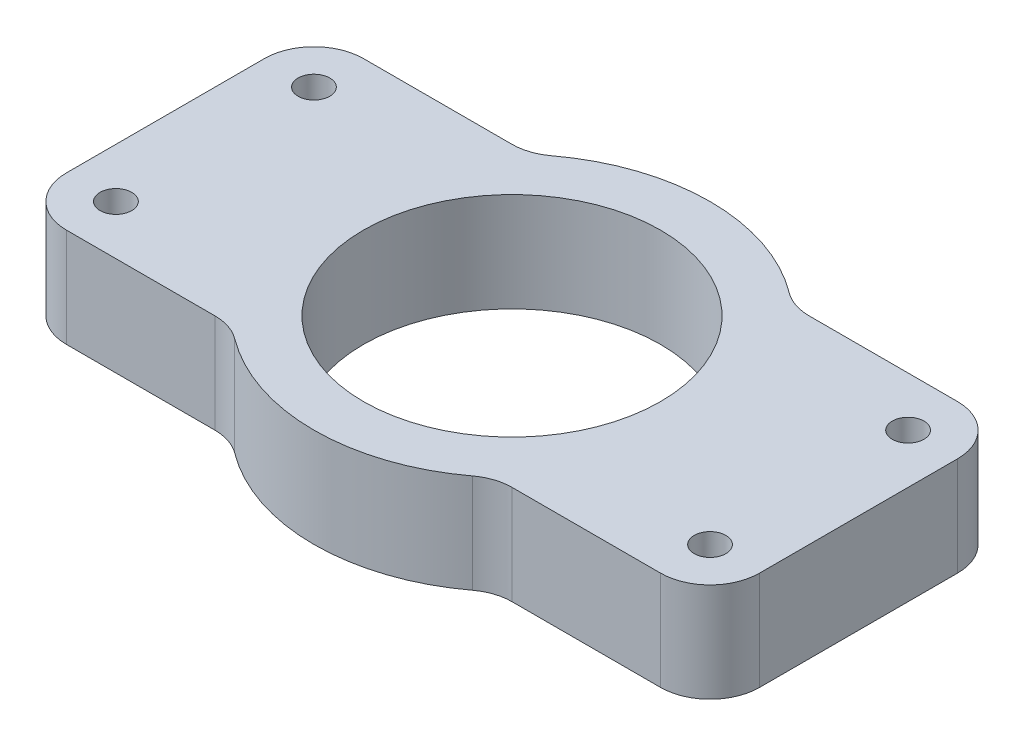
ISO-10303-21;
HEADER;
FILE_DESCRIPTION(('STEP AP214'),'2;1');
FILE_NAME('part.step','',(''),(''),'','','');
FILE_SCHEMA(('AUTOMOTIVE_DESIGN { 1 0 10303 214 1 1 1 1 }'));
ENDSEC;
DATA;
#1=APPLICATION_CONTEXT('core data for automotive mechanical design processes');
#2=APPLICATION_PROTOCOL_DEFINITION('international standard','automotive_design',2000,#1);
#3=PRODUCT_CONTEXT('',#1,'mechanical');
#4=PRODUCT('Part','Part','',(#3));
#5=PRODUCT_RELATED_PRODUCT_CATEGORY('part','',(#4));
#6=PRODUCT_DEFINITION_FORMATION('','',#4);
#7=PRODUCT_DEFINITION_CONTEXT('part definition',#1,'design');
#8=PRODUCT_DEFINITION('design','',#6,#7);
#9=PRODUCT_DEFINITION_SHAPE('','',#8);
#10=(LENGTH_UNIT() NAMED_UNIT(*) SI_UNIT(.MILLI.,.METRE.));
#11=(NAMED_UNIT(*) PLANE_ANGLE_UNIT() SI_UNIT($,.RADIAN.));
#12=(NAMED_UNIT(*) SI_UNIT($,.STERADIAN.) SOLID_ANGLE_UNIT());
#13=UNCERTAINTY_MEASURE_WITH_UNIT(LENGTH_MEASURE(1.E-05),#10,'distance_accuracy_value','');
#14=(GEOMETRIC_REPRESENTATION_CONTEXT(3) GLOBAL_UNCERTAINTY_ASSIGNED_CONTEXT((#13)) GLOBAL_UNIT_ASSIGNED_CONTEXT((#10,
#11,#12)) REPRESENTATION_CONTEXT('',''));
#15=CARTESIAN_POINT('',(0.,0.,0.));
#16=DIRECTION('',(0.,0.,1.));
#17=DIRECTION('',(1.,0.,0.));
#18=AXIS2_PLACEMENT_3D('',#15,#16,#17);
#19=CARTESIAN_POINT('',(-35.,10.,-15.));
#20=DIRECTION('',(0.,0.,1.));
#21=DIRECTION('',(1.,0.,0.));
#22=AXIS2_PLACEMENT_3D('',#19,#20,#21);
#23=PLANE('',#22);
#24=DIRECTION('',(-1.,0.,0.));
#25=VECTOR('',#24,1.);
#26=CARTESIAN_POINT('',(-35.,10.,-15.));
#27=LINE('',#26,#25);
#28=CARTESIAN_POINT('',(-15.,10.,-15.));
#29=VERTEX_POINT('',#28);
#30=CARTESIAN_POINT('',(-30.,10.,-15.));
#31=VERTEX_POINT('',#30);
#32=EDGE_CURVE('E197',#29,#31,#27,.T.);
#33=ORIENTED_EDGE('',*,*,#32,.F.);
#34=DIRECTION('',(0.,1.,0.));
#35=VECTOR('',#34,1.);
#36=CARTESIAN_POINT('',(-15.,0.,-15.));
#37=LINE('',#36,#35);
#38=CARTESIAN_POINT('',(-15.,0.,-15.));
#39=VERTEX_POINT('',#38);
#40=EDGE_CURVE('E221',#29,#39,#37,.F.);
#41=ORIENTED_EDGE('',*,*,#40,.T.);
#42=DIRECTION('',(-1.,0.,0.));
#43=VECTOR('',#42,1.);
#44=CARTESIAN_POINT('',(-35.,0.,-15.));
#45=LINE('',#44,#43);
#46=CARTESIAN_POINT('',(-30.,0.,-15.));
#47=VERTEX_POINT('',#46);
#48=EDGE_CURVE('E209',#39,#47,#45,.T.);
#49=ORIENTED_EDGE('',*,*,#48,.T.);
#50=DIRECTION('',(0.,-1.,0.));
#51=VECTOR('',#50,1.);
#52=CARTESIAN_POINT('',(-30.,10.,-15.));
#53=LINE('',#52,#51);
#54=EDGE_CURVE('E219',#47,#31,#53,.F.);
#55=ORIENTED_EDGE('',*,*,#54,.T.);
#56=EDGE_LOOP('',(#33,#41,#49,#55));
#57=FACE_BOUND('',#56,.T.);
#58=ADVANCED_FACE('F43',(#57),#23,.F.);
#59=CARTESIAN_POINT('',(30.,0.,-15.));
#60=VERTEX_POINT('',#59);
#61=CARTESIAN_POINT('',(15.,0.,-15.));
#62=VERTEX_POINT('',#61);
#63=EDGE_CURVE('E210',#60,#62,#45,.T.);
#64=ORIENTED_EDGE('',*,*,#63,.T.);
#65=DIRECTION('',(0.,1.,0.));
#66=VECTOR('',#65,1.);
#67=CARTESIAN_POINT('',(15.,10.,-15.));
#68=LINE('',#67,#66);
#69=CARTESIAN_POINT('',(15.,10.,-15.));
#70=VERTEX_POINT('',#69);
#71=EDGE_CURVE('E162',#62,#70,#68,.T.);
#72=ORIENTED_EDGE('',*,*,#71,.T.);
#73=CARTESIAN_POINT('',(30.,10.,-15.));
#74=VERTEX_POINT('',#73);
#75=EDGE_CURVE('E199',#74,#70,#27,.T.);
#76=ORIENTED_EDGE('',*,*,#75,.F.);
#77=DIRECTION('',(0.,-1.,0.));
#78=VECTOR('',#77,1.);
#79=CARTESIAN_POINT('',(30.,10.,-15.));
#80=LINE('',#79,#78);
#81=EDGE_CURVE('E223',#74,#60,#80,.T.);
#82=ORIENTED_EDGE('',*,*,#81,.T.);
#83=EDGE_LOOP('',(#64,#72,#76,#82));
#84=FACE_BOUND('',#83,.T.);
#85=ADVANCED_FACE('F311',(#84),#23,.F.);
#86=CARTESIAN_POINT('',(-35.,10.,15.));
#87=DIRECTION('',(0.,0.,-1.));
#88=DIRECTION('',(-1.,0.,0.));
#89=AXIS2_PLACEMENT_3D('',#86,#87,#88);
#90=PLANE('',#89);
#91=DIRECTION('',(1.,0.,0.));
#92=VECTOR('',#91,1.);
#93=CARTESIAN_POINT('',(-35.,10.,15.));
#94=LINE('',#93,#92);
#95=CARTESIAN_POINT('',(15.,10.,15.));
#96=VERTEX_POINT('',#95);
#97=CARTESIAN_POINT('',(30.,10.,15.));
#98=VERTEX_POINT('',#97);
#99=EDGE_CURVE('E205',#96,#98,#94,.T.);
#100=ORIENTED_EDGE('',*,*,#99,.F.);
#101=DIRECTION('',(0.,1.,0.));
#102=VECTOR('',#101,1.);
#103=CARTESIAN_POINT('',(15.,0.,15.));
#104=LINE('',#103,#102);
#105=CARTESIAN_POINT('',(15.,0.,15.));
#106=VERTEX_POINT('',#105);
#107=EDGE_CURVE('E260',#96,#106,#104,.F.);
#108=ORIENTED_EDGE('',*,*,#107,.T.);
#109=DIRECTION('',(1.,0.,0.));
#110=VECTOR('',#109,1.);
#111=CARTESIAN_POINT('',(-35.,0.,15.));
#112=LINE('',#111,#110);
#113=CARTESIAN_POINT('',(30.,0.,15.));
#114=VERTEX_POINT('',#113);
#115=EDGE_CURVE('E215',#106,#114,#112,.T.);
#116=ORIENTED_EDGE('',*,*,#115,.T.);
#117=DIRECTION('',(0.,-1.,0.));
#118=VECTOR('',#117,1.);
#119=CARTESIAN_POINT('',(30.,10.,15.));
#120=LINE('',#119,#118);
#121=EDGE_CURVE('E258',#114,#98,#120,.F.);
#122=ORIENTED_EDGE('',*,*,#121,.T.);
#123=EDGE_LOOP('',(#100,#108,#116,#122));
#124=FACE_BOUND('',#123,.T.);
#125=ADVANCED_FACE('F297',(#124),#90,.F.);
#126=CARTESIAN_POINT('',(-30.,10.,15.));
#127=VERTEX_POINT('',#126);
#128=CARTESIAN_POINT('',(-15.,10.,15.));
#129=VERTEX_POINT('',#128);
#130=EDGE_CURVE('E180',#127,#129,#94,.T.);
#131=ORIENTED_EDGE('',*,*,#130,.F.);
#132=DIRECTION('',(0.,-1.,0.));
#133=VECTOR('',#132,1.);
#134=CARTESIAN_POINT('',(-30.,10.,15.));
#135=LINE('',#134,#133);
#136=CARTESIAN_POINT('',(-30.,0.,15.));
#137=VERTEX_POINT('',#136);
#138=EDGE_CURVE('E249',#127,#137,#135,.T.);
#139=ORIENTED_EDGE('',*,*,#138,.T.);
#140=CARTESIAN_POINT('',(-15.,0.,15.));
#141=VERTEX_POINT('',#140);
#142=EDGE_CURVE('E198',#137,#141,#112,.T.);
#143=ORIENTED_EDGE('',*,*,#142,.T.);
#144=DIRECTION('',(0.,1.,0.));
#145=VECTOR('',#144,1.);
#146=CARTESIAN_POINT('',(-15.,10.,15.));
#147=LINE('',#146,#145);
#148=EDGE_CURVE('E247',#141,#129,#147,.T.);
#149=ORIENTED_EDGE('',*,*,#148,.T.);
#150=EDGE_LOOP('',(#131,#139,#143,#149));
#151=FACE_BOUND('',#150,.T.);
#152=ADVANCED_FACE('F280',(#151),#90,.F.);
#153=CARTESIAN_POINT('',(35.,10.,15.));
#154=DIRECTION('',(-1.,0.,0.));
#155=DIRECTION('',(0.,0.,1.));
#156=AXIS2_PLACEMENT_3D('',#153,#154,#155);
#157=PLANE('',#156);
#158=DIRECTION('',(0.,0.,-1.));
#159=VECTOR('',#158,1.);
#160=CARTESIAN_POINT('',(35.,0.,15.));
#161=LINE('',#160,#159);
#162=CARTESIAN_POINT('',(35.,0.,10.));
#163=VERTEX_POINT('',#162);
#164=CARTESIAN_POINT('',(35.,0.,-10.));
#165=VERTEX_POINT('',#164);
#166=EDGE_CURVE('E207',#163,#165,#161,.T.);
#167=ORIENTED_EDGE('',*,*,#166,.T.);
#168=DIRECTION('',(0.,-1.,0.));
#169=VECTOR('',#168,1.);
#170=CARTESIAN_POINT('',(35.,10.,-10.));
#171=LINE('',#170,#169);
#172=CARTESIAN_POINT('',(35.,10.,-10.));
#173=VERTEX_POINT('',#172);
#174=EDGE_CURVE('E58',#165,#173,#171,.F.);
#175=ORIENTED_EDGE('',*,*,#174,.T.);
#176=DIRECTION('',(0.,0.,-1.));
#177=VECTOR('',#176,1.);
#178=CARTESIAN_POINT('',(35.,10.,15.));
#179=LINE('',#178,#177);
#180=CARTESIAN_POINT('',(35.,10.,10.));
#181=VERTEX_POINT('',#180);
#182=EDGE_CURVE('E195',#181,#173,#179,.T.);
#183=ORIENTED_EDGE('',*,*,#182,.F.);
#184=DIRECTION('',(0.,-1.,0.));
#185=VECTOR('',#184,1.);
#186=CARTESIAN_POINT('',(35.,10.,10.));
#187=LINE('',#186,#185);
#188=EDGE_CURVE('E262',#181,#163,#187,.T.);
#189=ORIENTED_EDGE('',*,*,#188,.T.);
#190=EDGE_LOOP('',(#167,#175,#183,#189));
#191=FACE_BOUND('',#190,.T.);
#192=ADVANCED_FACE('F304',(#191),#157,.F.);
#193=CARTESIAN_POINT('',(-35.,10.,15.));
#194=DIRECTION('',(1.,0.,0.));
#195=DIRECTION('',(0.,0.,-1.));
#196=AXIS2_PLACEMENT_3D('',#193,#194,#195);
#197=PLANE('',#196);
#198=DIRECTION('',(0.,0.,1.));
#199=VECTOR('',#198,1.);
#200=CARTESIAN_POINT('',(-35.,10.,15.));
#201=LINE('',#200,#199);
#202=CARTESIAN_POINT('',(-35.,10.,-10.));
#203=VERTEX_POINT('',#202);
#204=CARTESIAN_POINT('',(-35.,10.,10.));
#205=VERTEX_POINT('',#204);
#206=EDGE_CURVE('E202',#203,#205,#201,.T.);
#207=ORIENTED_EDGE('',*,*,#206,.F.);
#208=DIRECTION('',(0.,-1.,0.));
#209=VECTOR('',#208,1.);
#210=CARTESIAN_POINT('',(-35.,10.,-10.));
#211=LINE('',#210,#209);
#212=CARTESIAN_POINT('',(-35.,0.,-10.));
#213=VERTEX_POINT('',#212);
#214=EDGE_CURVE('E229',#203,#213,#211,.T.);
#215=ORIENTED_EDGE('',*,*,#214,.T.);
#216=DIRECTION('',(0.,0.,1.));
#217=VECTOR('',#216,1.);
#218=CARTESIAN_POINT('',(-35.,0.,15.));
#219=LINE('',#218,#217);
#220=CARTESIAN_POINT('',(-35.,0.,10.));
#221=VERTEX_POINT('',#220);
#222=EDGE_CURVE('E212',#213,#221,#219,.T.);
#223=ORIENTED_EDGE('',*,*,#222,.T.);
#224=DIRECTION('',(0.,-1.,0.));
#225=VECTOR('',#224,1.);
#226=CARTESIAN_POINT('',(-35.,10.,10.));
#227=LINE('',#226,#225);
#228=EDGE_CURVE('E227',#221,#205,#227,.F.);
#229=ORIENTED_EDGE('',*,*,#228,.T.);
#230=EDGE_LOOP('',(#207,#215,#223,#229));
#231=FACE_BOUND('',#230,.T.);
#232=ADVANCED_FACE('F340',(#231),#197,.F.);
#233=CARTESIAN_POINT('',(0.,10.,0.));
#234=DIRECTION('',(0.,-1.,0.));
#235=DIRECTION('',(0.,0.,-1.));
#236=AXIS2_PLACEMENT_3D('',#233,#234,#235);
#237=PLANE('',#236);
#238=CARTESIAN_POINT('',(-30.,10.,10.));
#239=DIRECTION('',(0.,-1.,0.));
#240=DIRECTION('',(0.,0.,-1.));
#241=AXIS2_PLACEMENT_3D('',#238,#239,#240);
#242=CIRCLE('',#241,1.6);
#243=CARTESIAN_POINT('',(-30.,10.,8.4));
#244=VERTEX_POINT('',#243);
#245=EDGE_CURVE('E387',#244,#244,#242,.T.);
#246=ORIENTED_EDGE('',*,*,#245,.T.);
#247=EDGE_LOOP('',(#246));
#248=FACE_BOUND('',#247,.T.);
#249=CARTESIAN_POINT('',(30.,10.,-10.));
#250=DIRECTION('',(0.,-1.,0.));
#251=DIRECTION('',(0.,0.,-1.));
#252=AXIS2_PLACEMENT_3D('',#249,#250,#251);
#253=CIRCLE('',#252,1.6);
#254=CARTESIAN_POINT('',(30.,10.,-11.6));
#255=VERTEX_POINT('',#254);
#256=EDGE_CURVE('E383',#255,#255,#253,.T.);
#257=ORIENTED_EDGE('',*,*,#256,.T.);
#258=EDGE_LOOP('',(#257));
#259=FACE_BOUND('',#258,.T.);
#260=CARTESIAN_POINT('',(30.,10.,10.));
#261=DIRECTION('',(0.,-1.,0.));
#262=DIRECTION('',(0.,0.,-1.));
#263=AXIS2_PLACEMENT_3D('',#260,#261,#262);
#264=CIRCLE('',#263,1.6);
#265=CARTESIAN_POINT('',(30.,10.,8.4));
#266=VERTEX_POINT('',#265);
#267=EDGE_CURVE('E381',#266,#266,#264,.T.);
#268=ORIENTED_EDGE('',*,*,#267,.T.);
#269=EDGE_LOOP('',(#268));
#270=FACE_BOUND('',#269,.T.);
#271=CARTESIAN_POINT('',(-30.,10.,-10.));
#272=DIRECTION('',(0.,-1.,0.));
#273=DIRECTION('',(0.,0.,-1.));
#274=AXIS2_PLACEMENT_3D('',#271,#272,#273);
#275=CIRCLE('',#274,1.6);
#276=CARTESIAN_POINT('',(-30.,10.,-11.6));
#277=VERTEX_POINT('',#276);
#278=EDGE_CURVE('E384',#277,#277,#275,.T.);
#279=ORIENTED_EDGE('',*,*,#278,.T.);
#280=EDGE_LOOP('',(#279));
#281=FACE_BOUND('',#280,.T.);
#282=CARTESIAN_POINT('',(0.,10.,0.));
#283=DIRECTION('',(0.,-1.,0.));
#284=DIRECTION('',(0.,0.,-1.));
#285=AXIS2_PLACEMENT_3D('',#282,#283,#284);
#286=CIRCLE('',#285,15.);
#287=CARTESIAN_POINT('',(0.,10.,-15.));
#288=VERTEX_POINT('',#287);
#289=EDGE_CURVE('E192',#288,#288,#286,.T.);
#290=ORIENTED_EDGE('',*,*,#289,.T.);
#291=EDGE_LOOP('',(#290));
#292=FACE_BOUND('',#291,.T.);
#293=ORIENTED_EDGE('',*,*,#32,.T.);
#294=CARTESIAN_POINT('',(-30.,10.,-10.));
#295=DIRECTION('',(0.,-1.,0.));
#296=DIRECTION('',(0.,0.,-1.));
#297=AXIS2_PLACEMENT_3D('',#294,#295,#296);
#298=CIRCLE('',#297,5.);
#299=EDGE_CURVE('E245',#31,#203,#298,.F.);
#300=ORIENTED_EDGE('',*,*,#299,.T.);
#301=ORIENTED_EDGE('',*,*,#206,.T.);
#302=CARTESIAN_POINT('',(-30.,10.,10.));
#303=DIRECTION('',(0.,-1.,0.));
#304=DIRECTION('',(0.,0.,-1.));
#305=AXIS2_PLACEMENT_3D('',#302,#303,#304);
#306=CIRCLE('',#305,5.);
#307=EDGE_CURVE('E243',#205,#127,#306,.F.);
#308=ORIENTED_EDGE('',*,*,#307,.T.);
#309=ORIENTED_EDGE('',*,*,#130,.T.);
#310=CARTESIAN_POINT('',(-15.,10.,20.));
#311=DIRECTION('',(0.,-1.,0.));
#312=DIRECTION('',(0.,0.,-1.));
#313=AXIS2_PLACEMENT_3D('',#310,#311,#312);
#314=CIRCLE('',#313,5.);
#315=CARTESIAN_POINT('',(-12.,10.,16.));
#316=VERTEX_POINT('',#315);
#317=EDGE_CURVE('E11',#129,#316,#314,.T.);
#318=ORIENTED_EDGE('',*,*,#317,.T.);
#319=CARTESIAN_POINT('',(0.,10.,0.));
#320=DIRECTION('',(0.,1.,0.));
#321=DIRECTION('',(0.,0.,1.));
#322=AXIS2_PLACEMENT_3D('',#319,#320,#321);
#323=CIRCLE('',#322,20.);
#324=CARTESIAN_POINT('',(12.,10.,16.));
#325=VERTEX_POINT('',#324);
#326=EDGE_CURVE('E186',#316,#325,#323,.T.);
#327=ORIENTED_EDGE('',*,*,#326,.T.);
#328=CARTESIAN_POINT('',(15.,10.,20.));
#329=DIRECTION('',(0.,-1.,0.));
#330=DIRECTION('',(0.,0.,-1.));
#331=AXIS2_PLACEMENT_3D('',#328,#329,#330);
#332=CIRCLE('',#331,5.);
#333=EDGE_CURVE('E270',#325,#96,#332,.T.);
#334=ORIENTED_EDGE('',*,*,#333,.T.);
#335=ORIENTED_EDGE('',*,*,#99,.T.);
#336=CARTESIAN_POINT('',(30.,10.,10.));
#337=DIRECTION('',(0.,-1.,0.));
#338=DIRECTION('',(0.,0.,-1.));
#339=AXIS2_PLACEMENT_3D('',#336,#337,#338);
#340=CIRCLE('',#339,5.);
#341=EDGE_CURVE('E65',#98,#181,#340,.F.);
#342=ORIENTED_EDGE('',*,*,#341,.T.);
#343=ORIENTED_EDGE('',*,*,#182,.T.);
#344=CARTESIAN_POINT('',(30.,10.,-10.));
#345=DIRECTION('',(0.,-1.,0.));
#346=DIRECTION('',(0.,0.,-1.));
#347=AXIS2_PLACEMENT_3D('',#344,#345,#346);
#348=CIRCLE('',#347,5.);
#349=EDGE_CURVE('E241',#173,#74,#348,.F.);
#350=ORIENTED_EDGE('',*,*,#349,.T.);
#351=ORIENTED_EDGE('',*,*,#75,.T.);
#352=CARTESIAN_POINT('',(15.,10.,-20.));
#353=DIRECTION('',(0.,-1.,0.));
#354=DIRECTION('',(0.,0.,-1.));
#355=AXIS2_PLACEMENT_3D('',#352,#353,#354);
#356=CIRCLE('',#355,5.);
#357=CARTESIAN_POINT('',(12.,10.,-16.));
#358=VERTEX_POINT('',#357);
#359=EDGE_CURVE('E167',#70,#358,#356,.T.);
#360=ORIENTED_EDGE('',*,*,#359,.T.);
#361=CARTESIAN_POINT('',(-12.,10.,-16.));
#362=VERTEX_POINT('',#361);
#363=EDGE_CURVE('E178',#358,#362,#323,.T.);
#364=ORIENTED_EDGE('',*,*,#363,.T.);
#365=CARTESIAN_POINT('',(-15.,10.,-20.));
#366=DIRECTION('',(0.,-1.,0.));
#367=DIRECTION('',(0.,0.,-1.));
#368=AXIS2_PLACEMENT_3D('',#365,#366,#367);
#369=CIRCLE('',#368,5.);
#370=EDGE_CURVE('E266',#362,#29,#369,.T.);
#371=ORIENTED_EDGE('',*,*,#370,.T.);
#372=EDGE_LOOP('',(#293,#300,#301,#308,#309,#318,#327,#334,#335,#342,#343,#350,#351,#360,#364,#371));
#373=FACE_BOUND('',#372,.T.);
#374=ADVANCED_FACE('F287',(#248,#259,#270,#281,#292,#373),#237,.F.);
#375=CARTESIAN_POINT('',(0.,0.,0.));
#376=DIRECTION('',(0.,-1.,0.));
#377=DIRECTION('',(0.,0.,-1.));
#378=AXIS2_PLACEMENT_3D('',#375,#376,#377);
#379=PLANE('',#378);
#380=CARTESIAN_POINT('',(-30.,0.,10.));
#381=DIRECTION('',(0.,1.,0.));
#382=DIRECTION('',(0.,0.,1.));
#383=AXIS2_PLACEMENT_3D('',#380,#381,#382);
#384=CIRCLE('',#383,1.6);
#385=CARTESIAN_POINT('',(-30.,0.,11.6));
#386=VERTEX_POINT('',#385);
#387=EDGE_CURVE('E414',#386,#386,#384,.T.);
#388=ORIENTED_EDGE('',*,*,#387,.T.);
#389=EDGE_LOOP('',(#388));
#390=FACE_BOUND('',#389,.T.);
#391=CARTESIAN_POINT('',(30.,0.,-10.));
#392=DIRECTION('',(0.,1.,0.));
#393=DIRECTION('',(0.,0.,1.));
#394=AXIS2_PLACEMENT_3D('',#391,#392,#393);
#395=CIRCLE('',#394,1.6);
#396=CARTESIAN_POINT('',(30.,0.,-8.4));
#397=VERTEX_POINT('',#396);
#398=EDGE_CURVE('E417',#397,#397,#395,.T.);
#399=ORIENTED_EDGE('',*,*,#398,.T.);
#400=EDGE_LOOP('',(#399));
#401=FACE_BOUND('',#400,.T.);
#402=CARTESIAN_POINT('',(30.,0.,10.));
#403=DIRECTION('',(0.,1.,0.));
#404=DIRECTION('',(0.,0.,1.));
#405=AXIS2_PLACEMENT_3D('',#402,#403,#404);
#406=CIRCLE('',#405,1.6);
#407=CARTESIAN_POINT('',(30.,0.,11.6));
#408=VERTEX_POINT('',#407);
#409=EDGE_CURVE('E378',#408,#408,#406,.T.);
#410=ORIENTED_EDGE('',*,*,#409,.T.);
#411=EDGE_LOOP('',(#410));
#412=FACE_BOUND('',#411,.T.);
#413=CARTESIAN_POINT('',(-30.,0.,-10.));
#414=DIRECTION('',(0.,1.,0.));
#415=DIRECTION('',(0.,0.,1.));
#416=AXIS2_PLACEMENT_3D('',#413,#414,#415);
#417=CIRCLE('',#416,1.6);
#418=CARTESIAN_POINT('',(-30.,0.,-8.4));
#419=VERTEX_POINT('',#418);
#420=EDGE_CURVE('E390',#419,#419,#417,.T.);
#421=ORIENTED_EDGE('',*,*,#420,.T.);
#422=EDGE_LOOP('',(#421));
#423=FACE_BOUND('',#422,.T.);
#424=CARTESIAN_POINT('',(0.,0.,0.));
#425=DIRECTION('',(0.,1.,0.));
#426=DIRECTION('',(0.,0.,1.));
#427=AXIS2_PLACEMENT_3D('',#424,#425,#426);
#428=CIRCLE('',#427,15.);
#429=CARTESIAN_POINT('',(0.,0.,15.));
#430=VERTEX_POINT('',#429);
#431=EDGE_CURVE('E396',#430,#430,#428,.T.);
#432=ORIENTED_EDGE('',*,*,#431,.T.);
#433=EDGE_LOOP('',(#432));
#434=FACE_BOUND('',#433,.T.);
#435=ORIENTED_EDGE('',*,*,#222,.F.);
#436=CARTESIAN_POINT('',(-30.,0.,-10.));
#437=DIRECTION('',(0.,-1.,0.));
#438=DIRECTION('',(0.,0.,-1.));
#439=AXIS2_PLACEMENT_3D('',#436,#437,#438);
#440=CIRCLE('',#439,5.);
#441=EDGE_CURVE('E238',#213,#47,#440,.T.);
#442=ORIENTED_EDGE('',*,*,#441,.T.);
#443=ORIENTED_EDGE('',*,*,#48,.F.);
#444=CARTESIAN_POINT('',(-15.,0.,-20.));
#445=DIRECTION('',(0.,-1.,0.));
#446=DIRECTION('',(0.,0.,-1.));
#447=AXIS2_PLACEMENT_3D('',#444,#445,#446);
#448=CIRCLE('',#447,5.);
#449=CARTESIAN_POINT('',(-12.,0.,-16.));
#450=VERTEX_POINT('',#449);
#451=EDGE_CURVE('E168',#39,#450,#448,.F.);
#452=ORIENTED_EDGE('',*,*,#451,.T.);
#453=CARTESIAN_POINT('',(0.,0.,0.));
#454=DIRECTION('',(0.,1.,0.));
#455=DIRECTION('',(0.,0.,1.));
#456=AXIS2_PLACEMENT_3D('',#453,#454,#455);
#457=CIRCLE('',#456,20.);
#458=CARTESIAN_POINT('',(12.,0.,-16.));
#459=VERTEX_POINT('',#458);
#460=EDGE_CURVE('E175',#459,#450,#457,.T.);
#461=ORIENTED_EDGE('',*,*,#460,.F.);
#462=CARTESIAN_POINT('',(15.,0.,-20.));
#463=DIRECTION('',(0.,-1.,0.));
#464=DIRECTION('',(0.,0.,-1.));
#465=AXIS2_PLACEMENT_3D('',#462,#463,#464);
#466=CIRCLE('',#465,5.);
#467=EDGE_CURVE('E157',#459,#62,#466,.F.);
#468=ORIENTED_EDGE('',*,*,#467,.T.);
#469=ORIENTED_EDGE('',*,*,#63,.F.);
#470=CARTESIAN_POINT('',(30.,0.,-10.));
#471=DIRECTION('',(0.,-1.,0.));
#472=DIRECTION('',(0.,0.,-1.));
#473=AXIS2_PLACEMENT_3D('',#470,#471,#472);
#474=CIRCLE('',#473,5.);
#475=EDGE_CURVE('E234',#60,#165,#474,.T.);
#476=ORIENTED_EDGE('',*,*,#475,.T.);
#477=ORIENTED_EDGE('',*,*,#166,.F.);
#478=CARTESIAN_POINT('',(30.,0.,10.));
#479=DIRECTION('',(0.,-1.,0.));
#480=DIRECTION('',(0.,0.,-1.));
#481=AXIS2_PLACEMENT_3D('',#478,#479,#480);
#482=CIRCLE('',#481,5.);
#483=EDGE_CURVE('E232',#163,#114,#482,.T.);
#484=ORIENTED_EDGE('',*,*,#483,.T.);
#485=ORIENTED_EDGE('',*,*,#115,.F.);
#486=CARTESIAN_POINT('',(15.,0.,20.));
#487=DIRECTION('',(0.,-1.,0.));
#488=DIRECTION('',(0.,0.,-1.));
#489=AXIS2_PLACEMENT_3D('',#486,#487,#488);
#490=CIRCLE('',#489,5.);
#491=CARTESIAN_POINT('',(12.,0.,16.));
#492=VERTEX_POINT('',#491);
#493=EDGE_CURVE('E272',#106,#492,#490,.F.);
#494=ORIENTED_EDGE('',*,*,#493,.T.);
#495=CARTESIAN_POINT('',(-12.,0.,16.));
#496=VERTEX_POINT('',#495);
#497=EDGE_CURVE('E187',#496,#492,#457,.T.);
#498=ORIENTED_EDGE('',*,*,#497,.F.);
#499=CARTESIAN_POINT('',(-15.,0.,20.));
#500=DIRECTION('',(0.,-1.,0.));
#501=DIRECTION('',(0.,0.,-1.));
#502=AXIS2_PLACEMENT_3D('',#499,#500,#501);
#503=CIRCLE('',#502,5.);
#504=EDGE_CURVE('E51',#496,#141,#503,.F.);
#505=ORIENTED_EDGE('',*,*,#504,.T.);
#506=ORIENTED_EDGE('',*,*,#142,.F.);
#507=CARTESIAN_POINT('',(-30.,0.,10.));
#508=DIRECTION('',(0.,-1.,0.));
#509=DIRECTION('',(0.,0.,-1.));
#510=AXIS2_PLACEMENT_3D('',#507,#508,#509);
#511=CIRCLE('',#510,5.);
#512=EDGE_CURVE('E236',#137,#221,#511,.T.);
#513=ORIENTED_EDGE('',*,*,#512,.T.);
#514=EDGE_LOOP('',(#435,#442,#443,#452,#461,#468,#469,#476,#477,#484,#485,#494,#498,#505,#506,#513));
#515=FACE_BOUND('',#514,.T.);
#516=ADVANCED_FACE('F183',(#390,#401,#412,#423,#434,#515),#379,.T.);
#517=CARTESIAN_POINT('',(0.,10.,0.));
#518=DIRECTION('',(0.,-1.,0.));
#519=DIRECTION('',(0.,0.,-1.));
#520=AXIS2_PLACEMENT_3D('',#517,#518,#519);
#521=CYLINDRICAL_SURFACE('',#520,20.);
#522=ORIENTED_EDGE('',*,*,#497,.T.);
#523=DIRECTION('',(0.,-1.,0.));
#524=VECTOR('',#523,1.);
#525=CARTESIAN_POINT('',(12.,10.,16.));
#526=LINE('',#525,#524);
#527=EDGE_CURVE('E255',#492,#325,#526,.F.);
#528=ORIENTED_EDGE('',*,*,#527,.T.);
#529=ORIENTED_EDGE('',*,*,#326,.F.);
#530=DIRECTION('',(0.,-1.,0.));
#531=VECTOR('',#530,1.);
#532=CARTESIAN_POINT('',(-12.,10.,16.));
#533=LINE('',#532,#531);
#534=EDGE_CURVE('E252',#316,#496,#533,.T.);
#535=ORIENTED_EDGE('',*,*,#534,.T.);
#536=EDGE_LOOP('',(#522,#528,#529,#535));
#537=FACE_BOUND('',#536,.T.);
#538=ADVANCED_FACE('F289',(#537),#521,.T.);
#539=ORIENTED_EDGE('',*,*,#460,.T.);
#540=DIRECTION('',(0.,-1.,0.));
#541=VECTOR('',#540,1.);
#542=CARTESIAN_POINT('',(-12.,10.,-16.));
#543=LINE('',#542,#541);
#544=EDGE_CURVE('E179',#450,#362,#543,.F.);
#545=ORIENTED_EDGE('',*,*,#544,.T.);
#546=ORIENTED_EDGE('',*,*,#363,.F.);
#547=DIRECTION('',(0.,-1.,0.));
#548=VECTOR('',#547,1.);
#549=CARTESIAN_POINT('',(12.,10.,-16.));
#550=LINE('',#549,#548);
#551=EDGE_CURVE('E161',#358,#459,#550,.T.);
#552=ORIENTED_EDGE('',*,*,#551,.T.);
#553=EDGE_LOOP('',(#539,#545,#546,#552));
#554=FACE_BOUND('',#553,.T.);
#555=ADVANCED_FACE('F173',(#554),#521,.T.);
#556=CARTESIAN_POINT('',(0.,0.,0.));
#557=DIRECTION('',(0.,1.,0.));
#558=DIRECTION('',(0.,0.,1.));
#559=AXIS2_PLACEMENT_3D('',#556,#557,#558);
#560=CYLINDRICAL_SURFACE('',#559,15.);
#561=ORIENTED_EDGE('',*,*,#431,.F.);
#562=EDGE_LOOP('',(#561));
#563=FACE_BOUND('',#562,.T.);
#564=ORIENTED_EDGE('',*,*,#289,.F.);
#565=EDGE_LOOP('',(#564));
#566=FACE_BOUND('',#565,.T.);
#567=ADVANCED_FACE('F359',(#563,#566),#560,.F.);
#568=CARTESIAN_POINT('',(-30.,0.,-10.));
#569=DIRECTION('',(0.,1.,0.));
#570=DIRECTION('',(0.,0.,1.));
#571=AXIS2_PLACEMENT_3D('',#568,#569,#570);
#572=CYLINDRICAL_SURFACE('',#571,1.6);
#573=ORIENTED_EDGE('',*,*,#420,.F.);
#574=EDGE_LOOP('',(#573));
#575=FACE_BOUND('',#574,.T.);
#576=ORIENTED_EDGE('',*,*,#278,.F.);
#577=EDGE_LOOP('',(#576));
#578=FACE_BOUND('',#577,.T.);
#579=ADVANCED_FACE('F362',(#575,#578),#572,.F.);
#580=CARTESIAN_POINT('',(30.,0.,10.));
#581=DIRECTION('',(0.,1.,0.));
#582=DIRECTION('',(0.,0.,1.));
#583=AXIS2_PLACEMENT_3D('',#580,#581,#582);
#584=CYLINDRICAL_SURFACE('',#583,1.6);
#585=ORIENTED_EDGE('',*,*,#409,.F.);
#586=EDGE_LOOP('',(#585));
#587=FACE_BOUND('',#586,.T.);
#588=ORIENTED_EDGE('',*,*,#267,.F.);
#589=EDGE_LOOP('',(#588));
#590=FACE_BOUND('',#589,.T.);
#591=ADVANCED_FACE('F365',(#587,#590),#584,.F.);
#592=CARTESIAN_POINT('',(30.,0.,-10.));
#593=DIRECTION('',(0.,1.,0.));
#594=DIRECTION('',(0.,0.,1.));
#595=AXIS2_PLACEMENT_3D('',#592,#593,#594);
#596=CYLINDRICAL_SURFACE('',#595,1.6);
#597=ORIENTED_EDGE('',*,*,#398,.F.);
#598=EDGE_LOOP('',(#597));
#599=FACE_BOUND('',#598,.T.);
#600=ORIENTED_EDGE('',*,*,#256,.F.);
#601=EDGE_LOOP('',(#600));
#602=FACE_BOUND('',#601,.T.);
#603=ADVANCED_FACE('F330',(#599,#602),#596,.F.);
#604=CARTESIAN_POINT('',(-30.,0.,10.));
#605=DIRECTION('',(0.,1.,0.));
#606=DIRECTION('',(0.,0.,1.));
#607=AXIS2_PLACEMENT_3D('',#604,#605,#606);
#608=CYLINDRICAL_SURFACE('',#607,1.6);
#609=ORIENTED_EDGE('',*,*,#387,.F.);
#610=EDGE_LOOP('',(#609));
#611=FACE_BOUND('',#610,.T.);
#612=ORIENTED_EDGE('',*,*,#245,.F.);
#613=EDGE_LOOP('',(#612));
#614=FACE_BOUND('',#613,.T.);
#615=ADVANCED_FACE('F321',(#611,#614),#608,.F.);
#616=CARTESIAN_POINT('',(-15.,10.,-20.));
#617=DIRECTION('',(0.,-1.,0.));
#618=DIRECTION('',(0.,0.,-1.));
#619=AXIS2_PLACEMENT_3D('',#616,#617,#618);
#620=CYLINDRICAL_SURFACE('',#619,5.);
#621=ORIENTED_EDGE('',*,*,#451,.F.);
#622=ORIENTED_EDGE('',*,*,#40,.F.);
#623=ORIENTED_EDGE('',*,*,#370,.F.);
#624=ORIENTED_EDGE('',*,*,#544,.F.);
#625=EDGE_LOOP('',(#621,#622,#623,#624));
#626=FACE_BOUND('',#625,.T.);
#627=ADVANCED_FACE('F319',(#626),#620,.F.);
#628=CARTESIAN_POINT('',(15.,10.,-20.));
#629=DIRECTION('',(0.,-1.,0.));
#630=DIRECTION('',(0.,0.,-1.));
#631=AXIS2_PLACEMENT_3D('',#628,#629,#630);
#632=CYLINDRICAL_SURFACE('',#631,5.);
#633=ORIENTED_EDGE('',*,*,#359,.F.);
#634=ORIENTED_EDGE('',*,*,#71,.F.);
#635=ORIENTED_EDGE('',*,*,#467,.F.);
#636=ORIENTED_EDGE('',*,*,#551,.F.);
#637=EDGE_LOOP('',(#633,#634,#635,#636));
#638=FACE_BOUND('',#637,.T.);
#639=ADVANCED_FACE('F160',(#638),#632,.F.);
#640=CARTESIAN_POINT('',(-30.,10.,-10.));
#641=DIRECTION('',(0.,-1.,0.));
#642=DIRECTION('',(0.,0.,-1.));
#643=AXIS2_PLACEMENT_3D('',#640,#641,#642);
#644=CYLINDRICAL_SURFACE('',#643,5.);
#645=ORIENTED_EDGE('',*,*,#299,.F.);
#646=ORIENTED_EDGE('',*,*,#54,.F.);
#647=ORIENTED_EDGE('',*,*,#441,.F.);
#648=ORIENTED_EDGE('',*,*,#214,.F.);
#649=EDGE_LOOP('',(#645,#646,#647,#648));
#650=FACE_BOUND('',#649,.T.);
#651=ADVANCED_FACE('F327',(#650),#644,.T.);
#652=CARTESIAN_POINT('',(-30.,10.,10.));
#653=DIRECTION('',(0.,-1.,0.));
#654=DIRECTION('',(0.,0.,-1.));
#655=AXIS2_PLACEMENT_3D('',#652,#653,#654);
#656=CYLINDRICAL_SURFACE('',#655,5.);
#657=ORIENTED_EDGE('',*,*,#307,.F.);
#658=ORIENTED_EDGE('',*,*,#228,.F.);
#659=ORIENTED_EDGE('',*,*,#512,.F.);
#660=ORIENTED_EDGE('',*,*,#138,.F.);
#661=EDGE_LOOP('',(#657,#658,#659,#660));
#662=FACE_BOUND('',#661,.T.);
#663=ADVANCED_FACE('F458',(#662),#656,.T.);
#664=CARTESIAN_POINT('',(15.,10.,20.));
#665=DIRECTION('',(0.,-1.,0.));
#666=DIRECTION('',(0.,0.,-1.));
#667=AXIS2_PLACEMENT_3D('',#664,#665,#666);
#668=CYLINDRICAL_SURFACE('',#667,5.);
#669=ORIENTED_EDGE('',*,*,#493,.F.);
#670=ORIENTED_EDGE('',*,*,#107,.F.);
#671=ORIENTED_EDGE('',*,*,#333,.F.);
#672=ORIENTED_EDGE('',*,*,#527,.F.);
#673=EDGE_LOOP('',(#669,#670,#671,#672));
#674=FACE_BOUND('',#673,.T.);
#675=ADVANCED_FACE('F293',(#674),#668,.F.);
#676=CARTESIAN_POINT('',(-15.,10.,20.));
#677=DIRECTION('',(0.,-1.,0.));
#678=DIRECTION('',(0.,0.,-1.));
#679=AXIS2_PLACEMENT_3D('',#676,#677,#678);
#680=CYLINDRICAL_SURFACE('',#679,5.);
#681=ORIENTED_EDGE('',*,*,#317,.F.);
#682=ORIENTED_EDGE('',*,*,#148,.F.);
#683=ORIENTED_EDGE('',*,*,#504,.F.);
#684=ORIENTED_EDGE('',*,*,#534,.F.);
#685=EDGE_LOOP('',(#681,#682,#683,#684));
#686=FACE_BOUND('',#685,.T.);
#687=ADVANCED_FACE('F284',(#686),#680,.F.);
#688=CARTESIAN_POINT('',(30.,10.,-10.));
#689=DIRECTION('',(0.,-1.,0.));
#690=DIRECTION('',(0.,0.,-1.));
#691=AXIS2_PLACEMENT_3D('',#688,#689,#690);
#692=CYLINDRICAL_SURFACE('',#691,5.);
#693=ORIENTED_EDGE('',*,*,#349,.F.);
#694=ORIENTED_EDGE('',*,*,#174,.F.);
#695=ORIENTED_EDGE('',*,*,#475,.F.);
#696=ORIENTED_EDGE('',*,*,#81,.F.);
#697=EDGE_LOOP('',(#693,#694,#695,#696));
#698=FACE_BOUND('',#697,.T.);
#699=ADVANCED_FACE('F308',(#698),#692,.T.);
#700=CARTESIAN_POINT('',(30.,10.,10.));
#701=DIRECTION('',(0.,-1.,0.));
#702=DIRECTION('',(0.,0.,-1.));
#703=AXIS2_PLACEMENT_3D('',#700,#701,#702);
#704=CYLINDRICAL_SURFACE('',#703,5.);
#705=ORIENTED_EDGE('',*,*,#341,.F.);
#706=ORIENTED_EDGE('',*,*,#121,.F.);
#707=ORIENTED_EDGE('',*,*,#483,.F.);
#708=ORIENTED_EDGE('',*,*,#188,.F.);
#709=EDGE_LOOP('',(#705,#706,#707,#708));
#710=FACE_BOUND('',#709,.T.);
#711=ADVANCED_FACE('F45',(#710),#704,.T.);
#712=CLOSED_SHELL('',(#58,#85,#125,#152,#192,#232,#374,#516,#538,#555,#567,#579,#591,#603,#615,
#627,#639,#651,#663,#675,#687,#699,#711));
#713=MANIFOLD_SOLID_BREP('B2',#712);
#714=ADVANCED_BREP_SHAPE_REPRESENTATION('',(#18,#713),#14);
#715=SHAPE_DEFINITION_REPRESENTATION(#9,#714);
ENDSEC;
END-ISO-10303-21;
